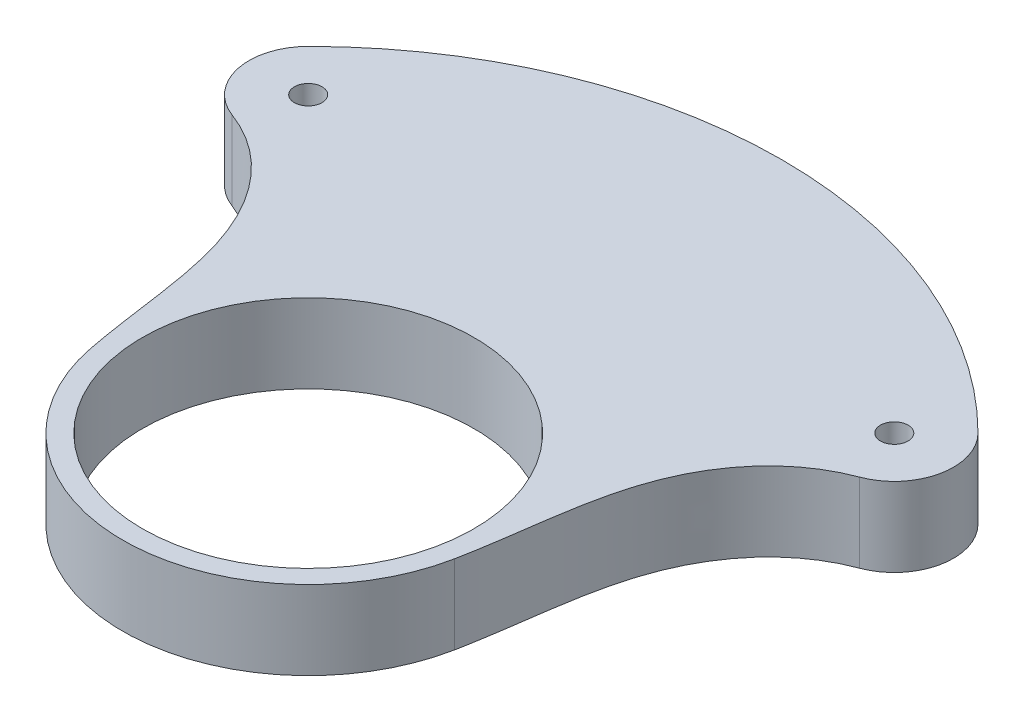
ISO-10303-21;
HEADER;
FILE_DESCRIPTION(('STEP AP214'),'2;1');
FILE_NAME('part.step','',(''),(''),'','','');
FILE_SCHEMA(('AUTOMOTIVE_DESIGN { 1 0 10303 214 1 1 1 1 }'));
ENDSEC;
DATA;
#1=APPLICATION_CONTEXT('core data for automotive mechanical design processes');
#2=APPLICATION_PROTOCOL_DEFINITION('international standard','automotive_design',2000,#1);
#3=PRODUCT_CONTEXT('',#1,'mechanical');
#4=PRODUCT('Part','Part','',(#3));
#5=PRODUCT_RELATED_PRODUCT_CATEGORY('part','',(#4));
#6=PRODUCT_DEFINITION_FORMATION('','',#4);
#7=PRODUCT_DEFINITION_CONTEXT('part definition',#1,'design');
#8=PRODUCT_DEFINITION('design','',#6,#7);
#9=PRODUCT_DEFINITION_SHAPE('','',#8);
#10=(LENGTH_UNIT() NAMED_UNIT(*) SI_UNIT(.MILLI.,.METRE.));
#11=(NAMED_UNIT(*) PLANE_ANGLE_UNIT() SI_UNIT($,.RADIAN.));
#12=(NAMED_UNIT(*) SI_UNIT($,.STERADIAN.) SOLID_ANGLE_UNIT());
#13=UNCERTAINTY_MEASURE_WITH_UNIT(LENGTH_MEASURE(1.E-05),#10,'distance_accuracy_value','');
#14=(GEOMETRIC_REPRESENTATION_CONTEXT(3) GLOBAL_UNCERTAINTY_ASSIGNED_CONTEXT((#13)) GLOBAL_UNIT_ASSIGNED_CONTEXT((#10,
#11,#12)) REPRESENTATION_CONTEXT('',''));
#15=CARTESIAN_POINT('',(0.,0.,0.));
#16=DIRECTION('',(0.,0.,1.));
#17=DIRECTION('',(1.,0.,0.));
#18=AXIS2_PLACEMENT_3D('',#15,#16,#17);
#19=CARTESIAN_POINT('',(37.1231060122938,10.,-37.1231060122937));
#20=DIRECTION('',(0.,-1.,0.));
#21=DIRECTION('',(0.,0.,-1.));
#22=AXIS2_PLACEMENT_3D('',#19,#20,#21);
#23=CYLINDRICAL_SURFACE('',#22,7.5);
#24=CARTESIAN_POINT('',(37.1231060122938,0.,-37.1231060122937));
#25=DIRECTION('',(0.,1.,0.));
#26=DIRECTION('',(0.,0.,1.));
#27=AXIS2_PLACEMENT_3D('',#24,#25,#26);
#28=CIRCLE('',#27,7.5);
#29=CARTESIAN_POINT('',(42.4264068711929,0.,-42.4264068711928));
#30=VERTEX_POINT('',#29);
#31=CARTESIAN_POINT('',(39.7420017030734,0.,-30.0952055177778));
#32=VERTEX_POINT('',#31);
#33=EDGE_CURVE('E297',#30,#32,#28,.F.);
#34=ORIENTED_EDGE('',*,*,#33,.F.);
#35=DIRECTION('',(0.,-1.,0.));
#36=VECTOR('',#35,1.);
#37=CARTESIAN_POINT('',(42.4264068711929,10.,-42.4264068711928));
#38=LINE('',#37,#36);
#39=CARTESIAN_POINT('',(42.4264068711929,10.,-42.4264068711928));
#40=VERTEX_POINT('',#39);
#41=EDGE_CURVE('E169',#40,#30,#38,.T.);
#42=ORIENTED_EDGE('',*,*,#41,.F.);
#43=CARTESIAN_POINT('',(37.1231060122938,10.,-37.1231060122937));
#44=DIRECTION('',(0.,1.,0.));
#45=DIRECTION('',(0.,0.,1.));
#46=AXIS2_PLACEMENT_3D('',#43,#44,#45);
#47=CIRCLE('',#46,7.5);
#48=CARTESIAN_POINT('',(39.7420017030734,10.,-30.0952055177778));
#49=VERTEX_POINT('',#48);
#50=EDGE_CURVE('E247',#40,#49,#47,.F.);
#51=ORIENTED_EDGE('',*,*,#50,.T.);
#52=DIRECTION('',(0.,-1.,0.));
#53=VECTOR('',#52,1.);
#54=CARTESIAN_POINT('',(39.7420017030734,10.,-30.0952055177778));
#55=LINE('',#54,#53);
#56=EDGE_CURVE('E12',#49,#32,#55,.T.);
#57=ORIENTED_EDGE('',*,*,#56,.T.);
#58=EDGE_LOOP('',(#34,#42,#51,#57));
#59=FACE_BOUND('',#58,.T.);
#60=ADVANCED_FACE('F158',(#59),#23,.T.);
#61=CARTESIAN_POINT('',(0.,10.,0.));
#62=DIRECTION('',(0.,-1.,0.));
#63=DIRECTION('',(0.,0.,-1.));
#64=AXIS2_PLACEMENT_3D('',#61,#62,#63);
#65=CYLINDRICAL_SURFACE('',#64,60.);
#66=CARTESIAN_POINT('',(0.,0.,0.));
#67=DIRECTION('',(0.,1.,0.));
#68=DIRECTION('',(0.,0.,1.));
#69=AXIS2_PLACEMENT_3D('',#66,#67,#68);
#70=CIRCLE('',#69,60.);
#71=CARTESIAN_POINT('',(-42.4264068711929,0.,-42.4264068711928));
#72=VERTEX_POINT('',#71);
#73=EDGE_CURVE('E301',#30,#72,#70,.T.);
#74=ORIENTED_EDGE('',*,*,#73,.T.);
#75=DIRECTION('',(0.,-1.,0.));
#76=VECTOR('',#75,1.);
#77=CARTESIAN_POINT('',(-42.4264068711929,10.,-42.4264068711928));
#78=LINE('',#77,#76);
#79=CARTESIAN_POINT('',(-42.4264068711929,10.,-42.4264068711928));
#80=VERTEX_POINT('',#79);
#81=EDGE_CURVE('E228',#80,#72,#78,.T.);
#82=ORIENTED_EDGE('',*,*,#81,.F.);
#83=CARTESIAN_POINT('',(0.,10.,0.));
#84=DIRECTION('',(0.,1.,0.));
#85=DIRECTION('',(0.,0.,1.));
#86=AXIS2_PLACEMENT_3D('',#83,#84,#85);
#87=CIRCLE('',#86,60.);
#88=EDGE_CURVE('E237',#40,#80,#87,.T.);
#89=ORIENTED_EDGE('',*,*,#88,.F.);
#90=ORIENTED_EDGE('',*,*,#41,.T.);
#91=EDGE_LOOP('',(#74,#82,#89,#90));
#92=FACE_BOUND('',#91,.T.);
#93=ADVANCED_FACE('F265',(#92),#65,.T.);
#94=CARTESIAN_POINT('',(-39.7420017030734,10.,-30.0952055177778));
#95=CARTESIAN_POINT('',(-34.3086039999246,10.,-28.0704896240095));
#96=CARTESIAN_POINT('',(-24.8133315955259,10.,-17.3717825968528));
#97=CARTESIAN_POINT('',(-24.750821327595,10.,-4.07439581543046));
#98=CARTESIAN_POINT('',(-23.0586272785893,10.,4.53317857877841));
#99=B_SPLINE_CURVE_WITH_KNOTS('',3,(#94,#95,#96,#97,#98),.UNSPECIFIED.,.F.,.F.,(4,1,4),(0.,
0.392292763126498,1.),.UNSPECIFIED.);
#100=DIRECTION('',(0.,-1.,0.));
#101=VECTOR('',#100,1.);
#102=SURFACE_OF_LINEAR_EXTRUSION('',#99,#101);
#103=CARTESIAN_POINT('',(-39.7420017030734,0.,-30.0952055177778));
#104=CARTESIAN_POINT('',(-34.3086039999246,0.,-28.0704896240095));
#105=CARTESIAN_POINT('',(-24.8133315955259,0.,-17.3717825968528));
#106=CARTESIAN_POINT('',(-24.750821327595,0.,-4.07439581543046));
#107=CARTESIAN_POINT('',(-23.0586272785893,0.,4.53317857877841));
#108=B_SPLINE_CURVE_WITH_KNOTS('',3,(#103,#104,#105,#106,#107),.UNSPECIFIED.,.F.,.F.,(4,1,4),
(0.,0.392292763126498,1.),.UNSPECIFIED.);
#109=CARTESIAN_POINT('',(-39.7420017030734,0.,-30.0952055177778));
#110=VERTEX_POINT('',#109);
#111=CARTESIAN_POINT('',(-23.0586272785893,0.,4.53317857877841));
#112=VERTEX_POINT('',#111);
#113=EDGE_CURVE('E283',#110,#112,#108,.T.);
#114=ORIENTED_EDGE('',*,*,#113,.T.);
#115=DIRECTION('',(0.,-1.,0.));
#116=VECTOR('',#115,1.);
#117=CARTESIAN_POINT('',(-23.0586272785893,10.,4.53317857877841));
#118=LINE('',#117,#116);
#119=CARTESIAN_POINT('',(-23.0586272785893,10.,4.53317857877841));
#120=VERTEX_POINT('',#119);
#121=EDGE_CURVE('E197',#120,#112,#118,.T.);
#122=ORIENTED_EDGE('',*,*,#121,.F.);
#123=CARTESIAN_POINT('',(-39.7420017030734,10.,-30.0952055177778));
#124=VERTEX_POINT('',#123);
#125=EDGE_CURVE('E234',#124,#120,#99,.T.);
#126=ORIENTED_EDGE('',*,*,#125,.F.);
#127=DIRECTION('',(0.,-1.,0.));
#128=VECTOR('',#127,1.);
#129=CARTESIAN_POINT('',(-39.7420017030734,10.,-30.0952055177778));
#130=LINE('',#129,#128);
#131=EDGE_CURVE('E216',#124,#110,#130,.T.);
#132=ORIENTED_EDGE('',*,*,#131,.T.);
#133=EDGE_LOOP('',(#114,#122,#126,#132));
#134=FACE_BOUND('',#133,.T.);
#135=ADVANCED_FACE('F241',(#134),#102,.F.);
#136=CARTESIAN_POINT('',(39.7420017030734,10.,-30.0952055177778));
#137=CARTESIAN_POINT('',(34.3086039999246,10.,-28.0704896240095));
#138=CARTESIAN_POINT('',(24.8133315955259,10.,-17.3717825968528));
#139=CARTESIAN_POINT('',(24.750821327595,10.,-4.07439581543046));
#140=CARTESIAN_POINT('',(23.0586272785893,10.,4.53317857877841));
#141=B_SPLINE_CURVE_WITH_KNOTS('',3,(#136,#137,#138,#139,#140),.UNSPECIFIED.,.F.,.F.,(4,1,4),
(0.,0.392292763126498,1.),.UNSPECIFIED.);
#142=DIRECTION('',(0.,-1.,0.));
#143=VECTOR('',#142,1.);
#144=SURFACE_OF_LINEAR_EXTRUSION('',#141,#143);
#145=CARTESIAN_POINT('',(39.7420017030734,0.,-30.0952055177778));
#146=CARTESIAN_POINT('',(34.3086039999246,0.,-28.0704896240095));
#147=CARTESIAN_POINT('',(24.8133315955259,0.,-17.3717825968528));
#148=CARTESIAN_POINT('',(24.750821327595,0.,-4.07439581543046));
#149=CARTESIAN_POINT('',(23.0586272785893,0.,4.53317857877841));
#150=B_SPLINE_CURVE_WITH_KNOTS('',3,(#145,#146,#147,#148,#149),.UNSPECIFIED.,.F.,.F.,(4,1,4),
(0.,0.392292763126498,1.),.UNSPECIFIED.);
#151=CARTESIAN_POINT('',(23.0586272785893,0.,4.53317857877841));
#152=VERTEX_POINT('',#151);
#153=EDGE_CURVE('E239',#32,#152,#150,.T.);
#154=ORIENTED_EDGE('',*,*,#153,.F.);
#155=ORIENTED_EDGE('',*,*,#56,.F.);
#156=CARTESIAN_POINT('',(23.0586272785893,10.,4.53317857877841));
#157=VERTEX_POINT('',#156);
#158=EDGE_CURVE('E277',#49,#157,#141,.T.);
#159=ORIENTED_EDGE('',*,*,#158,.T.);
#160=DIRECTION('',(0.,-1.,0.));
#161=VECTOR('',#160,1.);
#162=CARTESIAN_POINT('',(23.0586272785893,10.,4.53317857877841));
#163=LINE('',#162,#161);
#164=EDGE_CURVE('E178',#157,#152,#163,.T.);
#165=ORIENTED_EDGE('',*,*,#164,.T.);
#166=EDGE_LOOP('',(#154,#155,#159,#165));
#167=FACE_BOUND('',#166,.T.);
#168=ADVANCED_FACE('F264',(#167),#144,.T.);
#169=CARTESIAN_POINT('',(0.,0.,0.));
#170=DIRECTION('',(0.,1.,0.));
#171=DIRECTION('',(0.,0.,1.));
#172=AXIS2_PLACEMENT_3D('',#169,#170,#171);
#173=PLANE('',#172);
#174=CARTESIAN_POINT('',(-37.1231060122938,0.,-37.1231060122937));
#175=DIRECTION('',(0.,1.,0.));
#176=DIRECTION('',(0.,0.,1.));
#177=AXIS2_PLACEMENT_3D('',#174,#175,#176);
#178=CIRCLE('',#177,1.75);
#179=CARTESIAN_POINT('',(-37.1231060122938,0.,-35.3731060122937));
#180=VERTEX_POINT('',#179);
#181=EDGE_CURVE('E328',#180,#180,#178,.F.);
#182=ORIENTED_EDGE('',*,*,#181,.F.);
#183=EDGE_LOOP('',(#182));
#184=FACE_BOUND('',#183,.T.);
#185=CARTESIAN_POINT('',(37.1231060122938,0.,-37.1231060122937));
#186=DIRECTION('',(0.,1.,0.));
#187=DIRECTION('',(0.,0.,1.));
#188=AXIS2_PLACEMENT_3D('',#185,#186,#187);
#189=CIRCLE('',#188,1.75);
#190=CARTESIAN_POINT('',(37.1231060122938,0.,-35.3731060122937));
#191=VERTEX_POINT('',#190);
#192=EDGE_CURVE('E365',#191,#191,#189,.F.);
#193=ORIENTED_EDGE('',*,*,#192,.F.);
#194=EDGE_LOOP('',(#193));
#195=FACE_BOUND('',#194,.T.);
#196=CARTESIAN_POINT('',(-37.1231060122938,0.,-37.1231060122937));
#197=DIRECTION('',(0.,1.,0.));
#198=DIRECTION('',(0.,0.,1.));
#199=AXIS2_PLACEMENT_3D('',#196,#197,#198);
#200=CIRCLE('',#199,7.5);
#201=EDGE_CURVE('E222',#72,#110,#200,.T.);
#202=ORIENTED_EDGE('',*,*,#201,.F.);
#203=ORIENTED_EDGE('',*,*,#73,.F.);
#204=ORIENTED_EDGE('',*,*,#33,.T.);
#205=ORIENTED_EDGE('',*,*,#153,.T.);
#206=CARTESIAN_POINT('',(0.,0.,0.));
#207=DIRECTION('',(0.,1.,0.));
#208=DIRECTION('',(0.,0.,1.));
#209=AXIS2_PLACEMENT_3D('',#206,#207,#208);
#210=CIRCLE('',#209,23.5);
#211=EDGE_CURVE('E162',#112,#152,#210,.T.);
#212=ORIENTED_EDGE('',*,*,#211,.F.);
#213=ORIENTED_EDGE('',*,*,#113,.F.);
#214=EDGE_LOOP('',(#202,#203,#204,#205,#212,#213));
#215=FACE_BOUND('',#214,.T.);
#216=CARTESIAN_POINT('',(0.,0.,0.));
#217=DIRECTION('',(0.,1.,0.));
#218=DIRECTION('',(0.,0.,1.));
#219=AXIS2_PLACEMENT_3D('',#216,#217,#218);
#220=CIRCLE('',#219,21.);
#221=CARTESIAN_POINT('',(0.,0.,21.));
#222=VERTEX_POINT('',#221);
#223=EDGE_CURVE('E325',#222,#222,#220,.T.);
#224=ORIENTED_EDGE('',*,*,#223,.T.);
#225=EDGE_LOOP('',(#224));
#226=FACE_BOUND('',#225,.T.);
#227=ADVANCED_FACE('F266',(#184,#195,#215,#226),#173,.F.);
#228=CARTESIAN_POINT('',(0.,10.,0.));
#229=DIRECTION('',(0.,1.,0.));
#230=DIRECTION('',(0.,0.,1.));
#231=AXIS2_PLACEMENT_3D('',#228,#229,#230);
#232=PLANE('',#231);
#233=CARTESIAN_POINT('',(-37.1231060122938,10.,-37.1231060122937));
#234=DIRECTION('',(0.,1.,0.));
#235=DIRECTION('',(0.,0.,1.));
#236=AXIS2_PLACEMENT_3D('',#233,#234,#235);
#237=CIRCLE('',#236,1.75);
#238=CARTESIAN_POINT('',(-37.1231060122938,10.,-35.3731060122937));
#239=VERTEX_POINT('',#238);
#240=EDGE_CURVE('E358',#239,#239,#237,.T.);
#241=ORIENTED_EDGE('',*,*,#240,.F.);
#242=EDGE_LOOP('',(#241));
#243=FACE_BOUND('',#242,.T.);
#244=CARTESIAN_POINT('',(37.1231060122938,10.,-37.1231060122937));
#245=DIRECTION('',(0.,1.,0.));
#246=DIRECTION('',(0.,0.,-1.));
#247=AXIS2_PLACEMENT_3D('',#244,#245,#246);
#248=CIRCLE('',#247,1.75);
#249=CARTESIAN_POINT('',(37.1231060122938,10.,-38.8731060122937));
#250=VERTEX_POINT('',#249);
#251=EDGE_CURVE('E284',#250,#250,#248,.T.);
#252=ORIENTED_EDGE('',*,*,#251,.F.);
#253=EDGE_LOOP('',(#252));
#254=FACE_BOUND('',#253,.T.);
#255=ORIENTED_EDGE('',*,*,#88,.T.);
#256=CARTESIAN_POINT('',(-37.1231060122938,10.,-37.1231060122937));
#257=DIRECTION('',(0.,1.,0.));
#258=DIRECTION('',(0.,0.,1.));
#259=AXIS2_PLACEMENT_3D('',#256,#257,#258);
#260=CIRCLE('',#259,7.5);
#261=EDGE_CURVE('E219',#80,#124,#260,.T.);
#262=ORIENTED_EDGE('',*,*,#261,.T.);
#263=ORIENTED_EDGE('',*,*,#125,.T.);
#264=CARTESIAN_POINT('',(0.,10.,0.));
#265=DIRECTION('',(0.,1.,0.));
#266=DIRECTION('',(0.,0.,1.));
#267=AXIS2_PLACEMENT_3D('',#264,#265,#266);
#268=CIRCLE('',#267,23.5);
#269=EDGE_CURVE('E292',#120,#157,#268,.T.);
#270=ORIENTED_EDGE('',*,*,#269,.T.);
#271=ORIENTED_EDGE('',*,*,#158,.F.);
#272=ORIENTED_EDGE('',*,*,#50,.F.);
#273=EDGE_LOOP('',(#255,#262,#263,#270,#271,#272));
#274=FACE_BOUND('',#273,.T.);
#275=CARTESIAN_POINT('',(0.,10.,0.));
#276=DIRECTION('',(0.,1.,0.));
#277=DIRECTION('',(0.,0.,1.));
#278=AXIS2_PLACEMENT_3D('',#275,#276,#277);
#279=CIRCLE('',#278,21.);
#280=CARTESIAN_POINT('',(0.,10.,21.));
#281=VERTEX_POINT('',#280);
#282=EDGE_CURVE('E321',#281,#281,#279,.T.);
#283=ORIENTED_EDGE('',*,*,#282,.F.);
#284=EDGE_LOOP('',(#283));
#285=FACE_BOUND('',#284,.T.);
#286=ADVANCED_FACE('F232',(#243,#254,#274,#285),#232,.T.);
#287=CARTESIAN_POINT('',(0.,10.,0.));
#288=DIRECTION('',(0.,-1.,0.));
#289=DIRECTION('',(0.,0.,-1.));
#290=AXIS2_PLACEMENT_3D('',#287,#288,#289);
#291=CYLINDRICAL_SURFACE('',#290,21.);
#292=ORIENTED_EDGE('',*,*,#282,.T.);
#293=EDGE_LOOP('',(#292));
#294=FACE_BOUND('',#293,.T.);
#295=ORIENTED_EDGE('',*,*,#223,.F.);
#296=EDGE_LOOP('',(#295));
#297=FACE_BOUND('',#296,.T.);
#298=ADVANCED_FACE('F332',(#294,#297),#291,.F.);
#299=CARTESIAN_POINT('',(0.,10.,0.));
#300=DIRECTION('',(0.,-1.,0.));
#301=DIRECTION('',(0.,0.,-1.));
#302=AXIS2_PLACEMENT_3D('',#299,#300,#301);
#303=CYLINDRICAL_SURFACE('',#302,23.5);
#304=ORIENTED_EDGE('',*,*,#164,.F.);
#305=ORIENTED_EDGE('',*,*,#269,.F.);
#306=ORIENTED_EDGE('',*,*,#121,.T.);
#307=ORIENTED_EDGE('',*,*,#211,.T.);
#308=EDGE_LOOP('',(#304,#305,#306,#307));
#309=FACE_BOUND('',#308,.T.);
#310=ADVANCED_FACE('F160',(#309),#303,.T.);
#311=CARTESIAN_POINT('',(-37.1231060122938,10.,-37.1231060122937));
#312=DIRECTION('',(0.,-1.,0.));
#313=DIRECTION('',(0.,0.,-1.));
#314=AXIS2_PLACEMENT_3D('',#311,#312,#313);
#315=CYLINDRICAL_SURFACE('',#314,7.5);
#316=ORIENTED_EDGE('',*,*,#131,.F.);
#317=ORIENTED_EDGE('',*,*,#261,.F.);
#318=ORIENTED_EDGE('',*,*,#81,.T.);
#319=ORIENTED_EDGE('',*,*,#201,.T.);
#320=EDGE_LOOP('',(#316,#317,#318,#319));
#321=FACE_BOUND('',#320,.T.);
#322=ADVANCED_FACE('F218',(#321),#315,.T.);
#323=CARTESIAN_POINT('',(37.1231060122938,-0.000999999999999265,-37.1231060122937));
#324=DIRECTION('',(0.,1.,0.));
#325=DIRECTION('',(0.,0.,1.));
#326=AXIS2_PLACEMENT_3D('',#323,#324,#325);
#327=CYLINDRICAL_SURFACE('',#326,1.75);
#328=ORIENTED_EDGE('',*,*,#251,.T.);
#329=EDGE_LOOP('',(#328));
#330=FACE_BOUND('',#329,.T.);
#331=ORIENTED_EDGE('',*,*,#192,.T.);
#332=EDGE_LOOP('',(#331));
#333=FACE_BOUND('',#332,.T.);
#334=ADVANCED_FACE('F337',(#330,#333),#327,.F.);
#335=CARTESIAN_POINT('',(-37.1231060122938,-0.000999999999999265,-37.1231060122937));
#336=DIRECTION('',(0.,1.,0.));
#337=DIRECTION('',(0.,0.,1.));
#338=AXIS2_PLACEMENT_3D('',#335,#336,#337);
#339=CYLINDRICAL_SURFACE('',#338,1.75);
#340=ORIENTED_EDGE('',*,*,#240,.T.);
#341=EDGE_LOOP('',(#340));
#342=FACE_BOUND('',#341,.T.);
#343=ORIENTED_EDGE('',*,*,#181,.T.);
#344=EDGE_LOOP('',(#343));
#345=FACE_BOUND('',#344,.T.);
#346=ADVANCED_FACE('F350',(#342,#345),#339,.F.);
#347=CLOSED_SHELL('',(#60,#93,#135,#168,#227,#286,#298,#310,#322,#334,#346));
#348=MANIFOLD_SOLID_BREP('B2',#347);
#349=ADVANCED_BREP_SHAPE_REPRESENTATION('',(#18,#348),#14);
#350=SHAPE_DEFINITION_REPRESENTATION(#9,#349);
ENDSEC;
END-ISO-10303-21;
